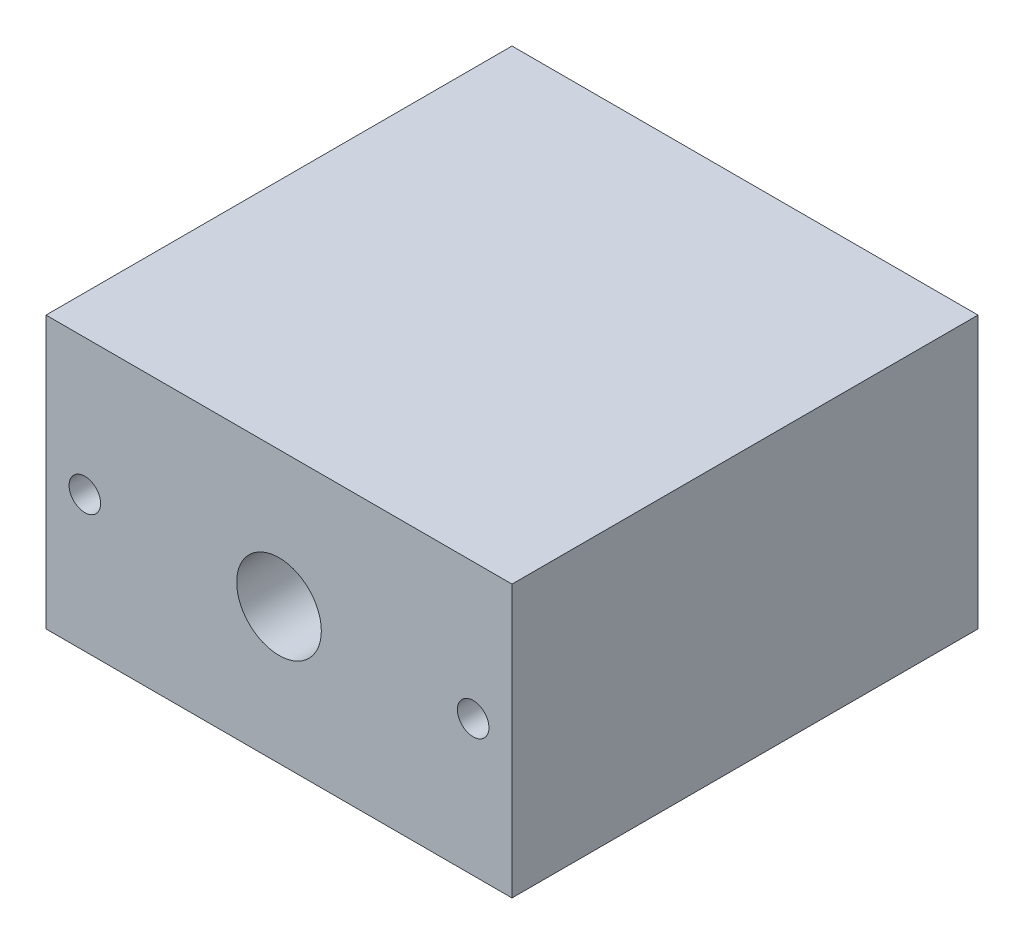
ISO-10303-21;
HEADER;
FILE_DESCRIPTION(('STEP AP214'),'2;1');
FILE_NAME('part.step','',(''),(''),'','','');
FILE_SCHEMA(('AUTOMOTIVE_DESIGN { 1 0 10303 214 1 1 1 1 }'));
ENDSEC;
DATA;
#1=APPLICATION_CONTEXT('core data for automotive mechanical design processes');
#2=APPLICATION_PROTOCOL_DEFINITION('international standard','automotive_design',2000,#1);
#3=PRODUCT_CONTEXT('',#1,'mechanical');
#4=PRODUCT('Part','Part','',(#3));
#5=PRODUCT_RELATED_PRODUCT_CATEGORY('part','',(#4));
#6=PRODUCT_DEFINITION_FORMATION('','',#4);
#7=PRODUCT_DEFINITION_CONTEXT('part definition',#1,'design');
#8=PRODUCT_DEFINITION('design','',#6,#7);
#9=PRODUCT_DEFINITION_SHAPE('','',#8);
#10=(LENGTH_UNIT() NAMED_UNIT(*) SI_UNIT(.MILLI.,.METRE.));
#11=(NAMED_UNIT(*) PLANE_ANGLE_UNIT() SI_UNIT($,.RADIAN.));
#12=(NAMED_UNIT(*) SI_UNIT($,.STERADIAN.) SOLID_ANGLE_UNIT());
#13=UNCERTAINTY_MEASURE_WITH_UNIT(LENGTH_MEASURE(1.E-05),#10,'distance_accuracy_value','');
#14=(GEOMETRIC_REPRESENTATION_CONTEXT(3) GLOBAL_UNCERTAINTY_ASSIGNED_CONTEXT((#13)) GLOBAL_UNIT_ASSIGNED_CONTEXT((#10,
#11,#12)) REPRESENTATION_CONTEXT('',''));
#15=CARTESIAN_POINT('',(0.,0.,0.));
#16=DIRECTION('',(0.,0.,1.));
#17=DIRECTION('',(1.,0.,0.));
#18=AXIS2_PLACEMENT_3D('',#15,#16,#17);
#19=CARTESIAN_POINT('',(0.,0.,152.4));
#20=DIRECTION('',(1.,0.,0.));
#21=DIRECTION('',(0.,0.,-1.));
#22=AXIS2_PLACEMENT_3D('',#19,#20,#21);
#23=PLANE('',#22);
#24=DIRECTION('',(0.,-1.,0.));
#25=VECTOR('',#24,1.);
#26=CARTESIAN_POINT('',(0.,0.,0.));
#27=LINE('',#26,#25);
#28=CARTESIAN_POINT('',(0.,88.9,0.));
#29=VERTEX_POINT('',#28);
#30=CARTESIAN_POINT('',(0.,0.,0.));
#31=VERTEX_POINT('',#30);
#32=EDGE_CURVE('E102',#29,#31,#27,.T.);
#33=ORIENTED_EDGE('',*,*,#32,.T.);
#34=DIRECTION('',(0.,0.,-1.));
#35=VECTOR('',#34,1.);
#36=CARTESIAN_POINT('',(0.,0.,152.4));
#37=LINE('',#36,#35);
#38=CARTESIAN_POINT('',(0.,0.,152.4));
#39=VERTEX_POINT('',#38);
#40=EDGE_CURVE('E11',#39,#31,#37,.T.);
#41=ORIENTED_EDGE('',*,*,#40,.F.);
#42=DIRECTION('',(0.,-1.,0.));
#43=VECTOR('',#42,1.);
#44=CARTESIAN_POINT('',(0.,0.,152.4));
#45=LINE('',#44,#43);
#46=CARTESIAN_POINT('',(0.,88.9,152.4));
#47=VERTEX_POINT('',#46);
#48=EDGE_CURVE('E90',#47,#39,#45,.T.);
#49=ORIENTED_EDGE('',*,*,#48,.F.);
#50=DIRECTION('',(0.,0.,-1.));
#51=VECTOR('',#50,1.);
#52=CARTESIAN_POINT('',(0.,88.9,152.4));
#53=LINE('',#52,#51);
#54=EDGE_CURVE('E98',#47,#29,#53,.T.);
#55=ORIENTED_EDGE('',*,*,#54,.T.);
#56=EDGE_LOOP('',(#33,#41,#49,#55));
#57=FACE_BOUND('',#56,.T.);
#58=ADVANCED_FACE('F39',(#57),#23,.F.);
#59=CARTESIAN_POINT('',(0.,0.,152.4));
#60=DIRECTION('',(0.,1.,0.));
#61=DIRECTION('',(0.,0.,1.));
#62=AXIS2_PLACEMENT_3D('',#59,#60,#61);
#63=PLANE('',#62);
#64=DIRECTION('',(1.,0.,0.));
#65=VECTOR('',#64,1.);
#66=CARTESIAN_POINT('',(0.,0.,0.));
#67=LINE('',#66,#65);
#68=CARTESIAN_POINT('',(152.4,0.,0.));
#69=VERTEX_POINT('',#68);
#70=EDGE_CURVE('E94',#31,#69,#67,.T.);
#71=ORIENTED_EDGE('',*,*,#70,.T.);
#72=DIRECTION('',(0.,0.,-1.));
#73=VECTOR('',#72,1.);
#74=CARTESIAN_POINT('',(152.4,0.,152.4));
#75=LINE('',#74,#73);
#76=CARTESIAN_POINT('',(152.4,0.,152.4));
#77=VERTEX_POINT('',#76);
#78=EDGE_CURVE('E47',#77,#69,#75,.T.);
#79=ORIENTED_EDGE('',*,*,#78,.F.);
#80=DIRECTION('',(1.,0.,0.));
#81=VECTOR('',#80,1.);
#82=CARTESIAN_POINT('',(0.,0.,152.4));
#83=LINE('',#82,#81);
#84=EDGE_CURVE('E85',#39,#77,#83,.T.);
#85=ORIENTED_EDGE('',*,*,#84,.F.);
#86=ORIENTED_EDGE('',*,*,#40,.T.);
#87=EDGE_LOOP('',(#71,#79,#85,#86));
#88=FACE_BOUND('',#87,.T.);
#89=ADVANCED_FACE('F93',(#88),#63,.F.);
#90=CARTESIAN_POINT('',(152.4,0.,152.4));
#91=DIRECTION('',(-1.,0.,0.));
#92=DIRECTION('',(0.,0.,1.));
#93=AXIS2_PLACEMENT_3D('',#90,#91,#92);
#94=PLANE('',#93);
#95=DIRECTION('',(0.,1.,0.));
#96=VECTOR('',#95,1.);
#97=CARTESIAN_POINT('',(152.4,0.,0.));
#98=LINE('',#97,#96);
#99=CARTESIAN_POINT('',(152.4,88.9,0.));
#100=VERTEX_POINT('',#99);
#101=EDGE_CURVE('E72',#69,#100,#98,.T.);
#102=ORIENTED_EDGE('',*,*,#101,.T.);
#103=DIRECTION('',(0.,0.,-1.));
#104=VECTOR('',#103,1.);
#105=CARTESIAN_POINT('',(152.4,88.9,152.4));
#106=LINE('',#105,#104);
#107=CARTESIAN_POINT('',(152.4,88.9,152.4));
#108=VERTEX_POINT('',#107);
#109=EDGE_CURVE('E95',#108,#100,#106,.T.);
#110=ORIENTED_EDGE('',*,*,#109,.F.);
#111=DIRECTION('',(0.,1.,0.));
#112=VECTOR('',#111,1.);
#113=CARTESIAN_POINT('',(152.4,0.,152.4));
#114=LINE('',#113,#112);
#115=EDGE_CURVE('E88',#77,#108,#114,.T.);
#116=ORIENTED_EDGE('',*,*,#115,.F.);
#117=ORIENTED_EDGE('',*,*,#78,.T.);
#118=EDGE_LOOP('',(#102,#110,#116,#117));
#119=FACE_BOUND('',#118,.T.);
#120=ADVANCED_FACE('F96',(#119),#94,.F.);
#121=CARTESIAN_POINT('',(0.,88.9,152.4));
#122=DIRECTION('',(0.,-1.,0.));
#123=DIRECTION('',(0.,0.,-1.));
#124=AXIS2_PLACEMENT_3D('',#121,#122,#123);
#125=PLANE('',#124);
#126=DIRECTION('',(-1.,0.,0.));
#127=VECTOR('',#126,1.);
#128=CARTESIAN_POINT('',(0.,88.9,0.));
#129=LINE('',#128,#127);
#130=EDGE_CURVE('E78',#100,#29,#129,.T.);
#131=ORIENTED_EDGE('',*,*,#130,.T.);
#132=ORIENTED_EDGE('',*,*,#54,.F.);
#133=DIRECTION('',(-1.,0.,0.));
#134=VECTOR('',#133,1.);
#135=CARTESIAN_POINT('',(0.,88.9,152.4));
#136=LINE('',#135,#134);
#137=EDGE_CURVE('E55',#108,#47,#136,.T.);
#138=ORIENTED_EDGE('',*,*,#137,.F.);
#139=ORIENTED_EDGE('',*,*,#109,.T.);
#140=EDGE_LOOP('',(#131,#132,#138,#139));
#141=FACE_BOUND('',#140,.T.);
#142=ADVANCED_FACE('F110',(#141),#125,.F.);
#143=CARTESIAN_POINT('',(0.,0.,152.4));
#144=DIRECTION('',(0.,0.,-1.));
#145=DIRECTION('',(-1.,0.,0.));
#146=AXIS2_PLACEMENT_3D('',#143,#144,#145);
#147=PLANE('',#146);
#148=CARTESIAN_POINT('',(12.7,44.45,152.4));
#149=DIRECTION('',(0.,0.,1.));
#150=DIRECTION('',(1.,0.,0.));
#151=AXIS2_PLACEMENT_3D('',#148,#149,#150);
#152=CIRCLE('',#151,5.1562);
#153=CARTESIAN_POINT('',(17.8562,44.45,152.4));
#154=VERTEX_POINT('',#153);
#155=EDGE_CURVE('E119',#154,#154,#152,.T.);
#156=ORIENTED_EDGE('',*,*,#155,.F.);
#157=EDGE_LOOP('',(#156));
#158=FACE_BOUND('',#157,.T.);
#159=CARTESIAN_POINT('',(139.7,44.45,152.4));
#160=DIRECTION('',(0.,0.,1.));
#161=DIRECTION('',(1.,0.,0.));
#162=AXIS2_PLACEMENT_3D('',#159,#160,#161);
#163=CIRCLE('',#162,5.1562);
#164=CARTESIAN_POINT('',(144.8562,44.45,152.4));
#165=VERTEX_POINT('',#164);
#166=EDGE_CURVE('E122',#165,#165,#163,.T.);
#167=ORIENTED_EDGE('',*,*,#166,.F.);
#168=EDGE_LOOP('',(#167));
#169=FACE_BOUND('',#168,.T.);
#170=CARTESIAN_POINT('',(76.2,44.45,152.4));
#171=DIRECTION('',(0.,0.,1.));
#172=DIRECTION('',(1.,0.,0.));
#173=AXIS2_PLACEMENT_3D('',#170,#171,#172);
#174=CIRCLE('',#173,13.843);
#175=CARTESIAN_POINT('',(90.043,44.45,152.4));
#176=VERTEX_POINT('',#175);
#177=EDGE_CURVE('E105',#176,#176,#174,.T.);
#178=ORIENTED_EDGE('',*,*,#177,.F.);
#179=EDGE_LOOP('',(#178));
#180=FACE_BOUND('',#179,.T.);
#181=ORIENTED_EDGE('',*,*,#48,.T.);
#182=ORIENTED_EDGE('',*,*,#84,.T.);
#183=ORIENTED_EDGE('',*,*,#115,.T.);
#184=ORIENTED_EDGE('',*,*,#137,.T.);
#185=EDGE_LOOP('',(#181,#182,#183,#184));
#186=FACE_BOUND('',#185,.T.);
#187=ADVANCED_FACE('F86',(#158,#169,#180,#186),#147,.F.);
#188=CARTESIAN_POINT('',(0.,0.,0.));
#189=DIRECTION('',(0.,0.,-1.));
#190=DIRECTION('',(-1.,0.,0.));
#191=AXIS2_PLACEMENT_3D('',#188,#189,#190);
#192=PLANE('',#191);
#193=CARTESIAN_POINT('',(12.7,44.45,0.));
#194=DIRECTION('',(0.,0.,1.));
#195=DIRECTION('',(1.,0.,0.));
#196=AXIS2_PLACEMENT_3D('',#193,#194,#195);
#197=CIRCLE('',#196,5.1562);
#198=CARTESIAN_POINT('',(17.8562,44.45,0.));
#199=VERTEX_POINT('',#198);
#200=EDGE_CURVE('E128',#199,#199,#197,.T.);
#201=ORIENTED_EDGE('',*,*,#200,.T.);
#202=EDGE_LOOP('',(#201));
#203=FACE_BOUND('',#202,.T.);
#204=CARTESIAN_POINT('',(139.7,44.45,0.));
#205=DIRECTION('',(0.,0.,1.));
#206=DIRECTION('',(1.,0.,0.));
#207=AXIS2_PLACEMENT_3D('',#204,#205,#206);
#208=CIRCLE('',#207,5.1562);
#209=CARTESIAN_POINT('',(144.8562,44.45,0.));
#210=VERTEX_POINT('',#209);
#211=EDGE_CURVE('E125',#210,#210,#208,.T.);
#212=ORIENTED_EDGE('',*,*,#211,.T.);
#213=EDGE_LOOP('',(#212));
#214=FACE_BOUND('',#213,.T.);
#215=CARTESIAN_POINT('',(76.2,44.45,0.));
#216=DIRECTION('',(0.,0.,1.));
#217=DIRECTION('',(1.,0.,0.));
#218=AXIS2_PLACEMENT_3D('',#215,#216,#217);
#219=CIRCLE('',#218,13.843);
#220=CARTESIAN_POINT('',(90.043,44.45,0.));
#221=VERTEX_POINT('',#220);
#222=EDGE_CURVE('E116',#221,#221,#219,.T.);
#223=ORIENTED_EDGE('',*,*,#222,.T.);
#224=EDGE_LOOP('',(#223));
#225=FACE_BOUND('',#224,.T.);
#226=ORIENTED_EDGE('',*,*,#32,.F.);
#227=ORIENTED_EDGE('',*,*,#130,.F.);
#228=ORIENTED_EDGE('',*,*,#101,.F.);
#229=ORIENTED_EDGE('',*,*,#70,.F.);
#230=EDGE_LOOP('',(#226,#227,#228,#229));
#231=FACE_BOUND('',#230,.T.);
#232=ADVANCED_FACE('F113',(#203,#214,#225,#231),#192,.T.);
#233=CARTESIAN_POINT('',(76.2,44.45,152.4));
#234=DIRECTION('',(0.,0.,-1.));
#235=DIRECTION('',(-1.,0.,0.));
#236=AXIS2_PLACEMENT_3D('',#233,#234,#235);
#237=CYLINDRICAL_SURFACE('',#236,13.843);
#238=ORIENTED_EDGE('',*,*,#177,.T.);
#239=EDGE_LOOP('',(#238));
#240=FACE_BOUND('',#239,.T.);
#241=ORIENTED_EDGE('',*,*,#222,.F.);
#242=EDGE_LOOP('',(#241));
#243=FACE_BOUND('',#242,.T.);
#244=ADVANCED_FACE('F144',(#240,#243),#237,.F.);
#245=CARTESIAN_POINT('',(139.7,44.45,152.4));
#246=DIRECTION('',(0.,0.,-1.));
#247=DIRECTION('',(-1.,0.,0.));
#248=AXIS2_PLACEMENT_3D('',#245,#246,#247);
#249=CYLINDRICAL_SURFACE('',#248,5.1562);
#250=ORIENTED_EDGE('',*,*,#166,.T.);
#251=EDGE_LOOP('',(#250));
#252=FACE_BOUND('',#251,.T.);
#253=ORIENTED_EDGE('',*,*,#211,.F.);
#254=EDGE_LOOP('',(#253));
#255=FACE_BOUND('',#254,.T.);
#256=ADVANCED_FACE('F147',(#252,#255),#249,.F.);
#257=CARTESIAN_POINT('',(12.7,44.45,152.4));
#258=DIRECTION('',(0.,0.,-1.));
#259=DIRECTION('',(-1.,0.,0.));
#260=AXIS2_PLACEMENT_3D('',#257,#258,#259);
#261=CYLINDRICAL_SURFACE('',#260,5.1562);
#262=ORIENTED_EDGE('',*,*,#155,.T.);
#263=EDGE_LOOP('',(#262));
#264=FACE_BOUND('',#263,.T.);
#265=ORIENTED_EDGE('',*,*,#200,.F.);
#266=EDGE_LOOP('',(#265));
#267=FACE_BOUND('',#266,.T.);
#268=ADVANCED_FACE('F134',(#264,#267),#261,.F.);
#269=CLOSED_SHELL('',(#58,#89,#120,#142,#187,#232,#244,#256,#268));
#270=MANIFOLD_SOLID_BREP('B2',#269);
#271=ADVANCED_BREP_SHAPE_REPRESENTATION('',(#18,#270),#14);
#272=SHAPE_DEFINITION_REPRESENTATION(#9,#271);
ENDSEC;
END-ISO-10303-21;
